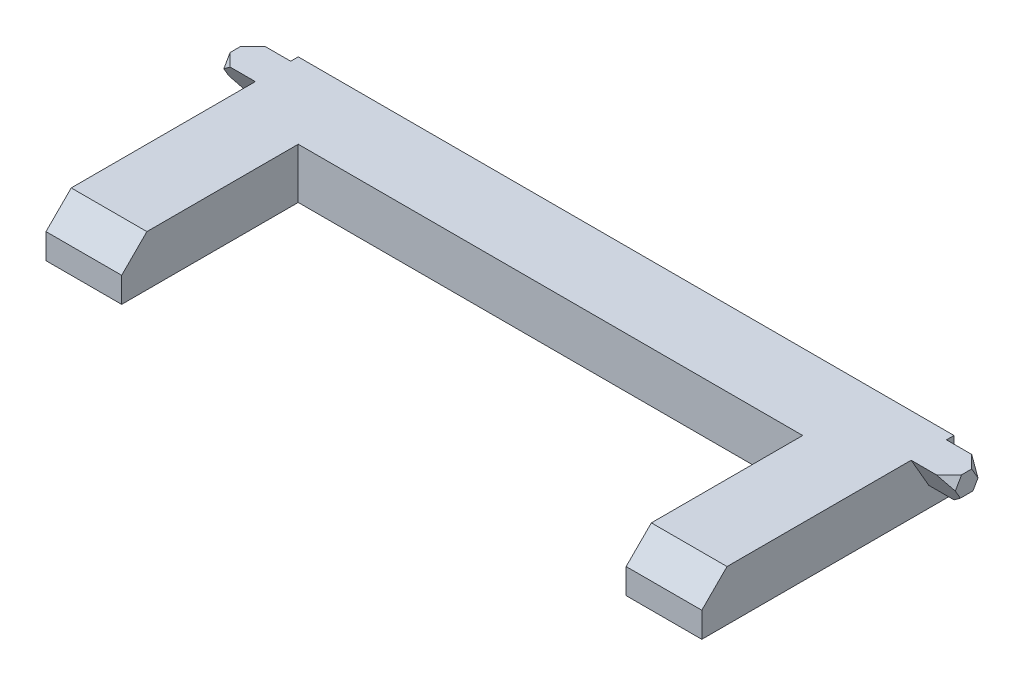
ISO-10303-21;
HEADER;
FILE_DESCRIPTION(('STEP AP214'),'2;1');
FILE_NAME('part.step','',(''),(''),'','','');
FILE_SCHEMA(('AUTOMOTIVE_DESIGN { 1 0 10303 214 1 1 1 1 }'));
ENDSEC;
DATA;
#1=APPLICATION_CONTEXT('core data for automotive mechanical design processes');
#2=APPLICATION_PROTOCOL_DEFINITION('international standard','automotive_design',2000,#1);
#3=PRODUCT_CONTEXT('',#1,'mechanical');
#4=PRODUCT('Part','Part','',(#3));
#5=PRODUCT_RELATED_PRODUCT_CATEGORY('part','',(#4));
#6=PRODUCT_DEFINITION_FORMATION('','',#4);
#7=PRODUCT_DEFINITION_CONTEXT('part definition',#1,'design');
#8=PRODUCT_DEFINITION('design','',#6,#7);
#9=PRODUCT_DEFINITION_SHAPE('','',#8);
#10=(LENGTH_UNIT() NAMED_UNIT(*) SI_UNIT(.MILLI.,.METRE.));
#11=(NAMED_UNIT(*) PLANE_ANGLE_UNIT() SI_UNIT($,.RADIAN.));
#12=(NAMED_UNIT(*) SI_UNIT($,.STERADIAN.) SOLID_ANGLE_UNIT());
#13=UNCERTAINTY_MEASURE_WITH_UNIT(LENGTH_MEASURE(1.E-05),#10,'distance_accuracy_value','');
#14=(GEOMETRIC_REPRESENTATION_CONTEXT(3) GLOBAL_UNCERTAINTY_ASSIGNED_CONTEXT((#13)) GLOBAL_UNIT_ASSIGNED_CONTEXT((#10,
#11,#12)) REPRESENTATION_CONTEXT('',''));
#15=CARTESIAN_POINT('',(0.,0.,0.));
#16=DIRECTION('',(0.,0.,1.));
#17=DIRECTION('',(1.,0.,0.));
#18=AXIS2_PLACEMENT_3D('',#15,#16,#17);
#19=CARTESIAN_POINT('',(0.,2.,0.));
#20=DIRECTION('',(0.,1.,0.));
#21=DIRECTION('',(0.,0.,1.));
#22=AXIS2_PLACEMENT_3D('',#19,#20,#21);
#23=PLANE('',#22);
#24=DIRECTION('',(-1.,0.,0.));
#25=VECTOR('',#24,1.);
#26=CARTESIAN_POINT('',(14.5,2.,5.99999999999999));
#27=LINE('',#26,#25);
#28=CARTESIAN_POINT('',(13.,2.,5.99999999999999));
#29=VERTEX_POINT('',#28);
#30=CARTESIAN_POINT('',(10.,2.,5.99999999999999));
#31=VERTEX_POINT('',#30);
#32=EDGE_CURVE('E189',#29,#31,#27,.T.);
#33=ORIENTED_EDGE('',*,*,#32,.F.);
#34=DIRECTION('',(0.,0.,-1.));
#35=VECTOR('',#34,1.);
#36=CARTESIAN_POINT('',(13.,2.,7.));
#37=LINE('',#36,#35);
#38=CARTESIAN_POINT('',(13.,2.,-1.3));
#39=VERTEX_POINT('',#38);
#40=EDGE_CURVE('E219',#29,#39,#37,.T.);
#41=ORIENTED_EDGE('',*,*,#40,.T.);
#42=DIRECTION('',(-1.,0.,0.));
#43=VECTOR('',#42,1.);
#44=CARTESIAN_POINT('',(14.5,2.,-1.3));
#45=LINE('',#44,#43);
#46=CARTESIAN_POINT('',(14.,2.,-1.3));
#47=VERTEX_POINT('',#46);
#48=EDGE_CURVE('E321',#47,#39,#45,.T.);
#49=ORIENTED_EDGE('',*,*,#48,.F.);
#50=DIRECTION('',(0.707106781186548,0.,-0.707106781186547));
#51=VECTOR('',#50,1.);
#52=CARTESIAN_POINT('',(6.34999999999999,2.,6.35));
#53=LINE('',#52,#51);
#54=CARTESIAN_POINT('',(14.5,2.,-1.8));
#55=VERTEX_POINT('',#54);
#56=EDGE_CURVE('E292',#47,#55,#53,.T.);
#57=ORIENTED_EDGE('',*,*,#56,.T.);
#58=DIRECTION('',(0.,0.,1.));
#59=VECTOR('',#58,1.);
#60=CARTESIAN_POINT('',(14.5,2.,-2.7));
#61=LINE('',#60,#59);
#62=CARTESIAN_POINT('',(14.5,2.,-2.2));
#63=VERTEX_POINT('',#62);
#64=EDGE_CURVE('E313',#63,#55,#61,.T.);
#65=ORIENTED_EDGE('',*,*,#64,.F.);
#66=DIRECTION('',(-0.707106781186548,0.,-0.707106781186547));
#67=VECTOR('',#66,1.);
#68=CARTESIAN_POINT('',(8.34999999999999,2.,-8.35));
#69=LINE('',#68,#67);
#70=CARTESIAN_POINT('',(14.,2.,-2.7));
#71=VERTEX_POINT('',#70);
#72=EDGE_CURVE('E301',#63,#71,#69,.T.);
#73=ORIENTED_EDGE('',*,*,#72,.T.);
#74=DIRECTION('',(-1.,0.,0.));
#75=VECTOR('',#74,1.);
#76=CARTESIAN_POINT('',(14.5,2.,-2.7));
#77=LINE('',#76,#75);
#78=CARTESIAN_POINT('',(13.,2.,-2.7));
#79=VERTEX_POINT('',#78);
#80=EDGE_CURVE('E336',#71,#79,#77,.T.);
#81=ORIENTED_EDGE('',*,*,#80,.T.);
#82=CARTESIAN_POINT('',(13.,2.,-3.));
#83=VERTEX_POINT('',#82);
#84=EDGE_CURVE('E218',#79,#83,#37,.T.);
#85=ORIENTED_EDGE('',*,*,#84,.T.);
#86=DIRECTION('',(-1.,0.,0.));
#87=VECTOR('',#86,1.);
#88=CARTESIAN_POINT('',(-10.,2.,-3.));
#89=LINE('',#88,#87);
#90=CARTESIAN_POINT('',(-13.,2.,-3.));
#91=VERTEX_POINT('',#90);
#92=EDGE_CURVE('E204',#83,#91,#89,.T.);
#93=ORIENTED_EDGE('',*,*,#92,.T.);
#94=DIRECTION('',(0.,0.,1.));
#95=VECTOR('',#94,1.);
#96=CARTESIAN_POINT('',(-13.,2.,7.));
#97=LINE('',#96,#95);
#98=CARTESIAN_POINT('',(-13.,2.,-2.7));
#99=VERTEX_POINT('',#98);
#100=EDGE_CURVE('E203',#91,#99,#97,.T.);
#101=ORIENTED_EDGE('',*,*,#100,.T.);
#102=DIRECTION('',(1.,0.,0.));
#103=VECTOR('',#102,1.);
#104=CARTESIAN_POINT('',(-14.5,2.,-2.7));
#105=LINE('',#104,#103);
#106=CARTESIAN_POINT('',(-14.,2.,-2.7));
#107=VERTEX_POINT('',#106);
#108=EDGE_CURVE('E353',#107,#99,#105,.T.);
#109=ORIENTED_EDGE('',*,*,#108,.F.);
#110=DIRECTION('',(-0.707106781186548,0.,0.707106781186547));
#111=VECTOR('',#110,1.);
#112=CARTESIAN_POINT('',(-8.34999999999999,2.,-8.35));
#113=LINE('',#112,#111);
#114=CARTESIAN_POINT('',(-14.5,2.,-2.2));
#115=VERTEX_POINT('',#114);
#116=EDGE_CURVE('E277',#107,#115,#113,.T.);
#117=ORIENTED_EDGE('',*,*,#116,.T.);
#118=DIRECTION('',(0.,0.,1.));
#119=VECTOR('',#118,1.);
#120=CARTESIAN_POINT('',(-14.5,2.,-2.7));
#121=LINE('',#120,#119);
#122=CARTESIAN_POINT('',(-14.5,2.,-1.79999999999999));
#123=VERTEX_POINT('',#122);
#124=EDGE_CURVE('E346',#115,#123,#121,.T.);
#125=ORIENTED_EDGE('',*,*,#124,.T.);
#126=DIRECTION('',(-0.707106781186548,0.,-0.707106781186547));
#127=VECTOR('',#126,1.);
#128=CARTESIAN_POINT('',(-6.34999999999999,2.,6.35));
#129=LINE('',#128,#127);
#130=CARTESIAN_POINT('',(-14.,2.,-1.3));
#131=VERTEX_POINT('',#130);
#132=EDGE_CURVE('E269',#131,#123,#129,.T.);
#133=ORIENTED_EDGE('',*,*,#132,.F.);
#134=DIRECTION('',(1.,0.,0.));
#135=VECTOR('',#134,1.);
#136=CARTESIAN_POINT('',(-14.5,2.,-1.3));
#137=LINE('',#136,#135);
#138=CARTESIAN_POINT('',(-13.,2.,-1.3));
#139=VERTEX_POINT('',#138);
#140=EDGE_CURVE('E201',#131,#139,#137,.T.);
#141=ORIENTED_EDGE('',*,*,#140,.T.);
#142=CARTESIAN_POINT('',(-13.,2.,5.99999999999999));
#143=VERTEX_POINT('',#142);
#144=EDGE_CURVE('E195',#139,#143,#97,.T.);
#145=ORIENTED_EDGE('',*,*,#144,.T.);
#146=CARTESIAN_POINT('',(-10.,2.,5.99999999999999));
#147=VERTEX_POINT('',#146);
#148=EDGE_CURVE('E181',#147,#143,#27,.T.);
#149=ORIENTED_EDGE('',*,*,#148,.F.);
#150=DIRECTION('',(0.,0.,-1.));
#151=VECTOR('',#150,1.);
#152=CARTESIAN_POINT('',(-10.,2.,0.));
#153=LINE('',#152,#151);
#154=CARTESIAN_POINT('',(-10.,2.,0.));
#155=VERTEX_POINT('',#154);
#156=EDGE_CURVE('E207',#147,#155,#153,.T.);
#157=ORIENTED_EDGE('',*,*,#156,.T.);
#158=DIRECTION('',(1.,0.,0.));
#159=VECTOR('',#158,1.);
#160=CARTESIAN_POINT('',(10.,2.,0.));
#161=LINE('',#160,#159);
#162=CARTESIAN_POINT('',(10.,2.,0.));
#163=VERTEX_POINT('',#162);
#164=EDGE_CURVE('E213',#155,#163,#161,.T.);
#165=ORIENTED_EDGE('',*,*,#164,.T.);
#166=DIRECTION('',(0.,0.,1.));
#167=VECTOR('',#166,1.);
#168=CARTESIAN_POINT('',(10.,2.,0.));
#169=LINE('',#168,#167);
#170=EDGE_CURVE('E215',#163,#31,#169,.T.);
#171=ORIENTED_EDGE('',*,*,#170,.T.);
#172=EDGE_LOOP('',(#33,#41,#49,#57,#65,#73,#81,#85,#93,#101,#109,#117,#125,#133,#141,#145,#149,
#157,#165,#171));
#173=FACE_BOUND('',#172,.T.);
#174=ADVANCED_FACE('F35',(#173),#23,.T.);
#175=CARTESIAN_POINT('',(13.,2.,7.));
#176=DIRECTION('',(-1.,0.,0.));
#177=DIRECTION('',(0.,0.,1.));
#178=AXIS2_PLACEMENT_3D('',#175,#176,#177);
#179=PLANE('',#178);
#180=ORIENTED_EDGE('',*,*,#40,.F.);
#181=DIRECTION('',(0.,-0.707106781186544,0.707106781186552));
#182=VECTOR('',#181,1.);
#183=CARTESIAN_POINT('',(13.,1.49999999999999,6.5));
#184=LINE('',#183,#182);
#185=CARTESIAN_POINT('',(13.,1.,7.));
#186=VERTEX_POINT('',#185);
#187=EDGE_CURVE('E330',#29,#186,#184,.T.);
#188=ORIENTED_EDGE('',*,*,#187,.T.);
#189=DIRECTION('',(0.,-1.,0.));
#190=VECTOR('',#189,1.);
#191=CARTESIAN_POINT('',(13.,2.,7.));
#192=LINE('',#191,#190);
#193=CARTESIAN_POINT('',(13.,0.,7.));
#194=VERTEX_POINT('',#193);
#195=EDGE_CURVE('E242',#186,#194,#192,.T.);
#196=ORIENTED_EDGE('',*,*,#195,.T.);
#197=DIRECTION('',(0.,0.,-1.));
#198=VECTOR('',#197,1.);
#199=CARTESIAN_POINT('',(13.,0.,7.));
#200=LINE('',#199,#198);
#201=CARTESIAN_POINT('',(13.,0.,-3.));
#202=VERTEX_POINT('',#201);
#203=EDGE_CURVE('E237',#194,#202,#200,.T.);
#204=ORIENTED_EDGE('',*,*,#203,.T.);
#205=DIRECTION('',(0.,-1.,0.));
#206=VECTOR('',#205,1.);
#207=CARTESIAN_POINT('',(13.,2.,-3.));
#208=LINE('',#207,#206);
#209=EDGE_CURVE('E221',#83,#202,#208,.T.);
#210=ORIENTED_EDGE('',*,*,#209,.F.);
#211=ORIENTED_EDGE('',*,*,#84,.F.);
#212=DIRECTION('',(0.,0.866025403784439,-0.5));
#213=VECTOR('',#212,1.);
#214=CARTESIAN_POINT('',(13.,0.787564434701785,-2.));
#215=LINE('',#214,#213);
#216=CARTESIAN_POINT('',(13.,0.787564434701785,-2.));
#217=VERTEX_POINT('',#216);
#218=EDGE_CURVE('E323',#217,#79,#215,.T.);
#219=ORIENTED_EDGE('',*,*,#218,.F.);
#220=DIRECTION('',(0.,-0.866025403784439,-0.5));
#221=VECTOR('',#220,1.);
#222=CARTESIAN_POINT('',(13.,2.,-1.3));
#223=LINE('',#222,#221);
#224=EDGE_CURVE('E327',#39,#217,#223,.T.);
#225=ORIENTED_EDGE('',*,*,#224,.F.);
#226=EDGE_LOOP('',(#180,#188,#196,#204,#210,#211,#219,#225));
#227=FACE_BOUND('',#226,.T.);
#228=ADVANCED_FACE('F388',(#227),#179,.F.);
#229=CARTESIAN_POINT('',(-14.5,0.787564434701785,-2.));
#230=DIRECTION('',(0.,-0.5,-0.866025403784439));
#231=DIRECTION('',(0.,0.866025403784439,-0.5));
#232=AXIS2_PLACEMENT_3D('',#229,#230,#231);
#233=PLANE('',#232);
#234=DIRECTION('',(0.,0.866025403784439,-0.5));
#235=VECTOR('',#234,1.);
#236=CARTESIAN_POINT('',(-14.5,0.787564434701785,-2.));
#237=LINE('',#236,#235);
#238=CARTESIAN_POINT('',(-14.5,1.22057713659401,-2.25));
#239=VERTEX_POINT('',#238);
#240=CARTESIAN_POINT('',(-14.5,1.56698729810778,-2.45));
#241=VERTEX_POINT('',#240);
#242=EDGE_CURVE('E342',#239,#241,#237,.T.);
#243=ORIENTED_EDGE('',*,*,#242,.T.);
#244=DIRECTION('',(0.707106781186548,0.612372435695794,-0.353553390593273));
#245=VECTOR('',#244,1.);
#246=CARTESIAN_POINT('',(-14.95,1.17727586640478,-2.225));
#247=LINE('',#246,#245);
#248=EDGE_CURVE('E280',#241,#107,#247,.T.);
#249=ORIENTED_EDGE('',*,*,#248,.T.);
#250=ORIENTED_EDGE('',*,*,#108,.T.);
#251=DIRECTION('',(0.,0.866025403784439,-0.5));
#252=VECTOR('',#251,1.);
#253=CARTESIAN_POINT('',(-13.,0.787564434701785,-2.));
#254=LINE('',#253,#252);
#255=CARTESIAN_POINT('',(-13.,0.787564434701785,-2.));
#256=VERTEX_POINT('',#255);
#257=EDGE_CURVE('E343',#256,#99,#254,.T.);
#258=ORIENTED_EDGE('',*,*,#257,.F.);
#259=DIRECTION('',(1.,0.,0.));
#260=VECTOR('',#259,1.);
#261=CARTESIAN_POINT('',(-14.5,0.787564434701785,-2.));
#262=LINE('',#261,#260);
#263=CARTESIAN_POINT('',(-14.,0.787564434701785,-2.));
#264=VERTEX_POINT('',#263);
#265=EDGE_CURVE('E348',#264,#256,#262,.T.);
#266=ORIENTED_EDGE('',*,*,#265,.F.);
#267=DIRECTION('',(0.707106781186548,-0.612372435695795,0.353553390593274));
#268=VECTOR('',#267,1.);
#269=CARTESIAN_POINT('',(-14.25,1.0040707856479,-2.125));
#270=LINE('',#269,#268);
#271=EDGE_CURVE('E261',#239,#264,#270,.T.);
#272=ORIENTED_EDGE('',*,*,#271,.F.);
#273=EDGE_LOOP('',(#243,#249,#250,#258,#266,#272));
#274=FACE_BOUND('',#273,.T.);
#275=ADVANCED_FACE('F361',(#274),#233,.T.);
#276=CARTESIAN_POINT('',(-14.5,0.,0.));
#277=DIRECTION('',(1.,0.,0.));
#278=DIRECTION('',(0.,0.,-1.));
#279=AXIS2_PLACEMENT_3D('',#276,#277,#278);
#280=PLANE('',#279);
#281=DIRECTION('',(0.,0.866025403784438,0.5));
#282=VECTOR('',#281,1.);
#283=CARTESIAN_POINT('',(-14.5,1.45262794416288,-2.51602540378444));
#284=LINE('',#283,#282);
#285=EDGE_CURVE('E275',#241,#115,#284,.T.);
#286=ORIENTED_EDGE('',*,*,#285,.F.);
#287=ORIENTED_EDGE('',*,*,#242,.F.);
#288=DIRECTION('',(0.,0.,1.));
#289=VECTOR('',#288,1.);
#290=CARTESIAN_POINT('',(-14.5,1.22057713659401,0.));
#291=LINE('',#290,#289);
#292=CARTESIAN_POINT('',(-14.5,1.22057713659401,-1.75));
#293=VERTEX_POINT('',#292);
#294=EDGE_CURVE('E263',#239,#293,#291,.T.);
#295=ORIENTED_EDGE('',*,*,#294,.T.);
#296=DIRECTION('',(0.,-0.866025403784439,-0.5));
#297=VECTOR('',#296,1.);
#298=CARTESIAN_POINT('',(-14.5,2.,-1.3));
#299=LINE('',#298,#297);
#300=CARTESIAN_POINT('',(-14.5,1.56698729810778,-1.55));
#301=VERTEX_POINT('',#300);
#302=EDGE_CURVE('E340',#301,#293,#299,.T.);
#303=ORIENTED_EDGE('',*,*,#302,.F.);
#304=DIRECTION('',(0.,0.866025403784439,-0.5));
#305=VECTOR('',#304,1.);
#306=CARTESIAN_POINT('',(-14.5,-0.279422863405994,-0.48397459621556));
#307=LINE('',#306,#305);
#308=EDGE_CURVE('E266',#301,#123,#307,.T.);
#309=ORIENTED_EDGE('',*,*,#308,.T.);
#310=ORIENTED_EDGE('',*,*,#124,.F.);
#311=EDGE_LOOP('',(#286,#287,#295,#303,#309,#310));
#312=FACE_BOUND('',#311,.T.);
#313=ADVANCED_FACE('F446',(#312),#280,.F.);
#314=CARTESIAN_POINT('',(-13.,2.,7.));
#315=DIRECTION('',(1.,0.,0.));
#316=DIRECTION('',(0.,0.,-1.));
#317=AXIS2_PLACEMENT_3D('',#314,#315,#316);
#318=PLANE('',#317);
#319=DIRECTION('',(0.,-1.,0.));
#320=VECTOR('',#319,1.);
#321=CARTESIAN_POINT('',(-13.,2.,7.));
#322=LINE('',#321,#320);
#323=CARTESIAN_POINT('',(-13.,1.,7.));
#324=VERTEX_POINT('',#323);
#325=CARTESIAN_POINT('',(-13.,0.,7.));
#326=VERTEX_POINT('',#325);
#327=EDGE_CURVE('E197',#324,#326,#322,.T.);
#328=ORIENTED_EDGE('',*,*,#327,.F.);
#329=DIRECTION('',(0.,-0.707106781186544,0.707106781186552));
#330=VECTOR('',#329,1.);
#331=CARTESIAN_POINT('',(-13.,1.,7.));
#332=LINE('',#331,#330);
#333=EDGE_CURVE('E184',#143,#324,#332,.T.);
#334=ORIENTED_EDGE('',*,*,#333,.F.);
#335=ORIENTED_EDGE('',*,*,#144,.F.);
#336=DIRECTION('',(0.,-0.866025403784439,-0.5));
#337=VECTOR('',#336,1.);
#338=CARTESIAN_POINT('',(-13.,2.,-1.3));
#339=LINE('',#338,#337);
#340=EDGE_CURVE('E335',#139,#256,#339,.T.);
#341=ORIENTED_EDGE('',*,*,#340,.T.);
#342=ORIENTED_EDGE('',*,*,#257,.T.);
#343=ORIENTED_EDGE('',*,*,#100,.F.);
#344=DIRECTION('',(0.,-1.,0.));
#345=VECTOR('',#344,1.);
#346=CARTESIAN_POINT('',(-13.,2.,-3.));
#347=LINE('',#346,#345);
#348=CARTESIAN_POINT('',(-13.,0.,-3.));
#349=VERTEX_POINT('',#348);
#350=EDGE_CURVE('E255',#91,#349,#347,.T.);
#351=ORIENTED_EDGE('',*,*,#350,.T.);
#352=DIRECTION('',(0.,0.,1.));
#353=VECTOR('',#352,1.);
#354=CARTESIAN_POINT('',(-13.,0.,7.));
#355=LINE('',#354,#353);
#356=EDGE_CURVE('E222',#349,#326,#355,.T.);
#357=ORIENTED_EDGE('',*,*,#356,.T.);
#358=EDGE_LOOP('',(#328,#334,#335,#341,#342,#343,#351,#357));
#359=FACE_BOUND('',#358,.T.);
#360=ADVANCED_FACE('F37',(#359),#318,.F.);
#361=CARTESIAN_POINT('',(-13.,2.,7.));
#362=DIRECTION('',(0.,0.,-1.));
#363=DIRECTION('',(-1.,0.,0.));
#364=AXIS2_PLACEMENT_3D('',#361,#362,#363);
#365=PLANE('',#364);
#366=DIRECTION('',(0.,-1.,0.));
#367=VECTOR('',#366,1.);
#368=CARTESIAN_POINT('',(-10.,2.,7.));
#369=LINE('',#368,#367);
#370=CARTESIAN_POINT('',(-10.,0.999999999999997,7.));
#371=VERTEX_POINT('',#370);
#372=CARTESIAN_POINT('',(-10.,0.,7.));
#373=VERTEX_POINT('',#372);
#374=EDGE_CURVE('E252',#371,#373,#369,.T.);
#375=ORIENTED_EDGE('',*,*,#374,.F.);
#376=DIRECTION('',(-1.,0.,0.));
#377=VECTOR('',#376,1.);
#378=CARTESIAN_POINT('',(14.5,1.,7.));
#379=LINE('',#378,#377);
#380=EDGE_CURVE('E50',#371,#324,#379,.T.);
#381=ORIENTED_EDGE('',*,*,#380,.T.);
#382=ORIENTED_EDGE('',*,*,#327,.T.);
#383=DIRECTION('',(1.,0.,0.));
#384=VECTOR('',#383,1.);
#385=CARTESIAN_POINT('',(-13.,0.,7.));
#386=LINE('',#385,#384);
#387=EDGE_CURVE('E224',#326,#373,#386,.T.);
#388=ORIENTED_EDGE('',*,*,#387,.T.);
#389=EDGE_LOOP('',(#375,#381,#382,#388));
#390=FACE_BOUND('',#389,.T.);
#391=ADVANCED_FACE('F380',(#390),#365,.F.);
#392=CARTESIAN_POINT('',(-10.,2.,0.));
#393=DIRECTION('',(-1.,0.,0.));
#394=DIRECTION('',(0.,0.,1.));
#395=AXIS2_PLACEMENT_3D('',#392,#393,#394);
#396=PLANE('',#395);
#397=ORIENTED_EDGE('',*,*,#156,.F.);
#398=DIRECTION('',(0.,-0.707106781186544,0.707106781186552));
#399=VECTOR('',#398,1.);
#400=CARTESIAN_POINT('',(-10.,4.99999999999999,2.99999999999996));
#401=LINE('',#400,#399);
#402=EDGE_CURVE('E185',#147,#371,#401,.T.);
#403=ORIENTED_EDGE('',*,*,#402,.T.);
#404=ORIENTED_EDGE('',*,*,#374,.T.);
#405=DIRECTION('',(0.,0.,-1.));
#406=VECTOR('',#405,1.);
#407=CARTESIAN_POINT('',(-10.,0.,0.));
#408=LINE('',#407,#406);
#409=CARTESIAN_POINT('',(-10.,0.,0.));
#410=VERTEX_POINT('',#409);
#411=EDGE_CURVE('E227',#373,#410,#408,.T.);
#412=ORIENTED_EDGE('',*,*,#411,.T.);
#413=DIRECTION('',(0.,-1.,0.));
#414=VECTOR('',#413,1.);
#415=CARTESIAN_POINT('',(-10.,2.,0.));
#416=LINE('',#415,#414);
#417=EDGE_CURVE('E249',#155,#410,#416,.T.);
#418=ORIENTED_EDGE('',*,*,#417,.F.);
#419=EDGE_LOOP('',(#397,#403,#404,#412,#418));
#420=FACE_BOUND('',#419,.T.);
#421=ADVANCED_FACE('F438',(#420),#396,.F.);
#422=CARTESIAN_POINT('',(10.,2.,0.));
#423=DIRECTION('',(0.,0.,-1.));
#424=DIRECTION('',(-1.,0.,0.));
#425=AXIS2_PLACEMENT_3D('',#422,#423,#424);
#426=PLANE('',#425);
#427=DIRECTION('',(1.,0.,0.));
#428=VECTOR('',#427,1.);
#429=CARTESIAN_POINT('',(10.,0.,0.));
#430=LINE('',#429,#428);
#431=CARTESIAN_POINT('',(10.,0.,0.));
#432=VERTEX_POINT('',#431);
#433=EDGE_CURVE('E229',#410,#432,#430,.T.);
#434=ORIENTED_EDGE('',*,*,#433,.T.);
#435=DIRECTION('',(0.,-1.,0.));
#436=VECTOR('',#435,1.);
#437=CARTESIAN_POINT('',(10.,2.,0.));
#438=LINE('',#437,#436);
#439=EDGE_CURVE('E246',#163,#432,#438,.T.);
#440=ORIENTED_EDGE('',*,*,#439,.F.);
#441=ORIENTED_EDGE('',*,*,#164,.F.);
#442=ORIENTED_EDGE('',*,*,#417,.T.);
#443=EDGE_LOOP('',(#434,#440,#441,#442));
#444=FACE_BOUND('',#443,.T.);
#445=ADVANCED_FACE('F434',(#444),#426,.F.);
#446=CARTESIAN_POINT('',(10.,2.,0.));
#447=DIRECTION('',(1.,0.,0.));
#448=DIRECTION('',(0.,0.,-1.));
#449=AXIS2_PLACEMENT_3D('',#446,#447,#448);
#450=PLANE('',#449);
#451=DIRECTION('',(0.,-1.,0.));
#452=VECTOR('',#451,1.);
#453=CARTESIAN_POINT('',(10.,2.,7.));
#454=LINE('',#453,#452);
#455=CARTESIAN_POINT('',(10.,1.,7.));
#456=VERTEX_POINT('',#455);
#457=CARTESIAN_POINT('',(10.,0.,7.));
#458=VERTEX_POINT('',#457);
#459=EDGE_CURVE('E244',#456,#458,#454,.T.);
#460=ORIENTED_EDGE('',*,*,#459,.F.);
#461=DIRECTION('',(0.,0.707106781186544,-0.707106781186552));
#462=VECTOR('',#461,1.);
#463=CARTESIAN_POINT('',(10.,4.99999999999999,2.99999999999996));
#464=LINE('',#463,#462);
#465=EDGE_CURVE('E58',#456,#31,#464,.T.);
#466=ORIENTED_EDGE('',*,*,#465,.T.);
#467=ORIENTED_EDGE('',*,*,#170,.F.);
#468=ORIENTED_EDGE('',*,*,#439,.T.);
#469=DIRECTION('',(0.,0.,1.));
#470=VECTOR('',#469,1.);
#471=CARTESIAN_POINT('',(10.,0.,0.));
#472=LINE('',#471,#470);
#473=EDGE_CURVE('E231',#432,#458,#472,.T.);
#474=ORIENTED_EDGE('',*,*,#473,.T.);
#475=EDGE_LOOP('',(#460,#466,#467,#468,#474));
#476=FACE_BOUND('',#475,.T.);
#477=ADVANCED_FACE('F431',(#476),#450,.F.);
#478=CARTESIAN_POINT('',(13.,2.,7.));
#479=DIRECTION('',(0.,0.,-1.));
#480=DIRECTION('',(-1.,0.,0.));
#481=AXIS2_PLACEMENT_3D('',#478,#479,#480);
#482=PLANE('',#481);
#483=ORIENTED_EDGE('',*,*,#195,.F.);
#484=DIRECTION('',(-1.,0.,0.));
#485=VECTOR('',#484,1.);
#486=CARTESIAN_POINT('',(13.,1.,7.));
#487=LINE('',#486,#485);
#488=EDGE_CURVE('E11',#186,#456,#487,.T.);
#489=ORIENTED_EDGE('',*,*,#488,.T.);
#490=ORIENTED_EDGE('',*,*,#459,.T.);
#491=DIRECTION('',(1.,0.,0.));
#492=VECTOR('',#491,1.);
#493=CARTESIAN_POINT('',(13.,0.,7.));
#494=LINE('',#493,#492);
#495=EDGE_CURVE('E234',#458,#194,#494,.T.);
#496=ORIENTED_EDGE('',*,*,#495,.T.);
#497=EDGE_LOOP('',(#483,#489,#490,#496));
#498=FACE_BOUND('',#497,.T.);
#499=ADVANCED_FACE('F391',(#498),#482,.F.);
#500=CARTESIAN_POINT('',(13.,2.,-3.));
#501=DIRECTION('',(0.,0.,1.));
#502=DIRECTION('',(1.,0.,0.));
#503=AXIS2_PLACEMENT_3D('',#500,#501,#502);
#504=PLANE('',#503);
#505=DIRECTION('',(-1.,0.,0.));
#506=VECTOR('',#505,1.);
#507=CARTESIAN_POINT('',(13.,0.,-3.));
#508=LINE('',#507,#506);
#509=EDGE_CURVE('E208',#202,#349,#508,.T.);
#510=ORIENTED_EDGE('',*,*,#509,.T.);
#511=ORIENTED_EDGE('',*,*,#350,.F.);
#512=ORIENTED_EDGE('',*,*,#92,.F.);
#513=ORIENTED_EDGE('',*,*,#209,.T.);
#514=EDGE_LOOP('',(#510,#511,#512,#513));
#515=FACE_BOUND('',#514,.T.);
#516=ADVANCED_FACE('F369',(#515),#504,.F.);
#517=CARTESIAN_POINT('',(0.,0.,0.));
#518=DIRECTION('',(0.,1.,0.));
#519=DIRECTION('',(0.,0.,1.));
#520=AXIS2_PLACEMENT_3D('',#517,#518,#519);
#521=PLANE('',#520);
#522=ORIENTED_EDGE('',*,*,#356,.F.);
#523=ORIENTED_EDGE('',*,*,#509,.F.);
#524=ORIENTED_EDGE('',*,*,#203,.F.);
#525=ORIENTED_EDGE('',*,*,#495,.F.);
#526=ORIENTED_EDGE('',*,*,#473,.F.);
#527=ORIENTED_EDGE('',*,*,#433,.F.);
#528=ORIENTED_EDGE('',*,*,#411,.F.);
#529=ORIENTED_EDGE('',*,*,#387,.F.);
#530=EDGE_LOOP('',(#522,#523,#524,#525,#526,#527,#528,#529));
#531=FACE_BOUND('',#530,.T.);
#532=ADVANCED_FACE('F374',(#531),#521,.F.);
#533=CARTESIAN_POINT('',(-14.5,2.,-1.3));
#534=DIRECTION('',(0.,-0.5,0.866025403784439));
#535=DIRECTION('',(0.,-0.866025403784439,-0.5));
#536=AXIS2_PLACEMENT_3D('',#533,#534,#535);
#537=PLANE('',#536);
#538=DIRECTION('',(0.707106781186548,0.612372435695794,0.353553390593274));
#539=VECTOR('',#538,1.);
#540=CARTESIAN_POINT('',(-14.25,1.78349364905389,-1.425));
#541=LINE('',#540,#539);
#542=EDGE_CURVE('E272',#301,#131,#541,.T.);
#543=ORIENTED_EDGE('',*,*,#542,.F.);
#544=ORIENTED_EDGE('',*,*,#302,.T.);
#545=DIRECTION('',(-0.707106781186548,0.612372435695794,0.353553390593274));
#546=VECTOR('',#545,1.);
#547=CARTESIAN_POINT('',(-14.95,1.610288568297,-1.525));
#548=LINE('',#547,#546);
#549=EDGE_CURVE('E258',#264,#293,#548,.T.);
#550=ORIENTED_EDGE('',*,*,#549,.F.);
#551=ORIENTED_EDGE('',*,*,#265,.T.);
#552=ORIENTED_EDGE('',*,*,#340,.F.);
#553=ORIENTED_EDGE('',*,*,#140,.F.);
#554=EDGE_LOOP('',(#543,#544,#550,#551,#552,#553));
#555=FACE_BOUND('',#554,.T.);
#556=ADVANCED_FACE('F358',(#555),#537,.T.);
#557=CARTESIAN_POINT('',(-5.61025668138921,-6.47816641044592,0.));
#558=DIRECTION('',(0.654653670707977,0.755928946018455,0.));
#559=DIRECTION('',(-0.755928946018455,0.654653670707977,0.));
#560=AXIS2_PLACEMENT_3D('',#557,#558,#559);
#561=PLANE('',#560);
#562=ORIENTED_EDGE('',*,*,#271,.T.);
#563=ORIENTED_EDGE('',*,*,#549,.T.);
#564=ORIENTED_EDGE('',*,*,#294,.F.);
#565=EDGE_LOOP('',(#562,#563,#564));
#566=FACE_BOUND('',#565,.T.);
#567=ADVANCED_FACE('F457',(#566),#561,.F.);
#568=CARTESIAN_POINT('',(-5.93772880216253,3.42814932230353,5.93772880216254));
#569=DIRECTION('',(0.654653670707977,-0.377964473009227,-0.654653670707977));
#570=DIRECTION('',(-0.707106781186548,0.,-0.707106781186547));
#571=AXIS2_PLACEMENT_3D('',#568,#569,#570);
#572=PLANE('',#571);
#573=ORIENTED_EDGE('',*,*,#308,.F.);
#574=ORIENTED_EDGE('',*,*,#542,.T.);
#575=ORIENTED_EDGE('',*,*,#132,.T.);
#576=EDGE_LOOP('',(#573,#574,#575));
#577=FACE_BOUND('',#576,.T.);
#578=ADVANCED_FACE('F460',(#577),#572,.F.);
#579=CARTESIAN_POINT('',(-7.65201451644824,4.41789264091432,-7.65201451644825));
#580=DIRECTION('',(-0.654653670707977,0.377964473009228,-0.654653670707977));
#581=DIRECTION('',(-0.707106781186548,0.,0.707106781186547));
#582=AXIS2_PLACEMENT_3D('',#579,#580,#581);
#583=PLANE('',#582);
#584=ORIENTED_EDGE('',*,*,#248,.F.);
#585=ORIENTED_EDGE('',*,*,#285,.T.);
#586=ORIENTED_EDGE('',*,*,#116,.F.);
#587=EDGE_LOOP('',(#584,#585,#586));
#588=FACE_BOUND('',#587,.T.);
#589=ADVANCED_FACE('F464',(#588),#583,.T.);
#590=CARTESIAN_POINT('',(14.5,2.,-1.3));
#591=DIRECTION('',(0.,0.5,-0.866025403784439));
#592=DIRECTION('',(0.,0.866025403784439,0.5));
#593=AXIS2_PLACEMENT_3D('',#590,#591,#592);
#594=PLANE('',#593);
#595=DIRECTION('',(0.707106781186548,-0.612372435695794,-0.353553390593274));
#596=VECTOR('',#595,1.);
#597=CARTESIAN_POINT('',(14.25,1.78349364905389,-1.425));
#598=LINE('',#597,#596);
#599=CARTESIAN_POINT('',(14.5,1.56698729810778,-1.55));
#600=VERTEX_POINT('',#599);
#601=EDGE_CURVE('E295',#47,#600,#598,.T.);
#602=ORIENTED_EDGE('',*,*,#601,.F.);
#603=ORIENTED_EDGE('',*,*,#48,.T.);
#604=ORIENTED_EDGE('',*,*,#224,.T.);
#605=DIRECTION('',(-1.,0.,0.));
#606=VECTOR('',#605,1.);
#607=CARTESIAN_POINT('',(14.5,0.787564434701785,-2.));
#608=LINE('',#607,#606);
#609=CARTESIAN_POINT('',(14.,0.787564434701785,-2.));
#610=VERTEX_POINT('',#609);
#611=EDGE_CURVE('E333',#610,#217,#608,.T.);
#612=ORIENTED_EDGE('',*,*,#611,.F.);
#613=DIRECTION('',(-0.707106781186548,-0.612372435695794,-0.353553390593274));
#614=VECTOR('',#613,1.);
#615=CARTESIAN_POINT('',(14.95,1.610288568297,-1.525));
#616=LINE('',#615,#614);
#617=CARTESIAN_POINT('',(14.5,1.22057713659401,-1.75));
#618=VERTEX_POINT('',#617);
#619=EDGE_CURVE('E283',#618,#610,#616,.T.);
#620=ORIENTED_EDGE('',*,*,#619,.F.);
#621=DIRECTION('',(0.,-0.866025403784439,-0.5));
#622=VECTOR('',#621,1.);
#623=CARTESIAN_POINT('',(14.5,2.,-1.3));
#624=LINE('',#623,#622);
#625=EDGE_CURVE('E319',#600,#618,#624,.T.);
#626=ORIENTED_EDGE('',*,*,#625,.F.);
#627=EDGE_LOOP('',(#602,#603,#604,#612,#620,#626));
#628=FACE_BOUND('',#627,.T.);
#629=ADVANCED_FACE('F401',(#628),#594,.F.);
#630=CARTESIAN_POINT('',(14.5,0.787564434701785,-2.));
#631=DIRECTION('',(0.,0.5,0.866025403784439));
#632=DIRECTION('',(0.,-0.866025403784439,0.5));
#633=AXIS2_PLACEMENT_3D('',#630,#631,#632);
#634=PLANE('',#633);
#635=DIRECTION('',(-0.707106781186548,0.612372435695794,-0.353553390593273));
#636=VECTOR('',#635,1.);
#637=CARTESIAN_POINT('',(14.95,1.17727586640478,-2.225));
#638=LINE('',#637,#636);
#639=CARTESIAN_POINT('',(14.5,1.56698729810778,-2.45));
#640=VERTEX_POINT('',#639);
#641=EDGE_CURVE('E303',#640,#71,#638,.T.);
#642=ORIENTED_EDGE('',*,*,#641,.F.);
#643=DIRECTION('',(0.,0.866025403784439,-0.5));
#644=VECTOR('',#643,1.);
#645=CARTESIAN_POINT('',(14.5,0.787564434701785,-2.));
#646=LINE('',#645,#644);
#647=CARTESIAN_POINT('',(14.5,1.22057713659401,-2.25));
#648=VERTEX_POINT('',#647);
#649=EDGE_CURVE('E315',#648,#640,#646,.T.);
#650=ORIENTED_EDGE('',*,*,#649,.F.);
#651=DIRECTION('',(0.707106781186548,0.612372435695795,-0.353553390593274));
#652=VECTOR('',#651,1.);
#653=CARTESIAN_POINT('',(14.25,1.0040707856479,-2.125));
#654=LINE('',#653,#652);
#655=EDGE_CURVE('E286',#610,#648,#654,.T.);
#656=ORIENTED_EDGE('',*,*,#655,.F.);
#657=ORIENTED_EDGE('',*,*,#611,.T.);
#658=ORIENTED_EDGE('',*,*,#218,.T.);
#659=ORIENTED_EDGE('',*,*,#80,.F.);
#660=EDGE_LOOP('',(#642,#650,#656,#657,#658,#659));
#661=FACE_BOUND('',#660,.T.);
#662=ADVANCED_FACE('F397',(#661),#634,.F.);
#663=CARTESIAN_POINT('',(14.5,0.,0.));
#664=DIRECTION('',(-1.,0.,0.));
#665=DIRECTION('',(0.,0.,-1.));
#666=AXIS2_PLACEMENT_3D('',#663,#664,#665);
#667=PLANE('',#666);
#668=DIRECTION('',(0.,-0.866025403784438,-0.5));
#669=VECTOR('',#668,1.);
#670=CARTESIAN_POINT('',(14.5,1.45262794416288,-2.51602540378444));
#671=LINE('',#670,#669);
#672=EDGE_CURVE('E43',#63,#640,#671,.T.);
#673=ORIENTED_EDGE('',*,*,#672,.F.);
#674=ORIENTED_EDGE('',*,*,#64,.T.);
#675=DIRECTION('',(0.,0.866025403784439,-0.5));
#676=VECTOR('',#675,1.);
#677=CARTESIAN_POINT('',(14.5,-0.279422863405994,-0.48397459621556));
#678=LINE('',#677,#676);
#679=EDGE_CURVE('E298',#600,#55,#678,.T.);
#680=ORIENTED_EDGE('',*,*,#679,.F.);
#681=ORIENTED_EDGE('',*,*,#625,.T.);
#682=DIRECTION('',(0.,0.,1.));
#683=VECTOR('',#682,1.);
#684=CARTESIAN_POINT('',(14.5,1.22057713659401,0.));
#685=LINE('',#684,#683);
#686=EDGE_CURVE('E289',#648,#618,#685,.T.);
#687=ORIENTED_EDGE('',*,*,#686,.F.);
#688=ORIENTED_EDGE('',*,*,#649,.T.);
#689=EDGE_LOOP('',(#673,#674,#680,#681,#687,#688));
#690=FACE_BOUND('',#689,.T.);
#691=ADVANCED_FACE('F312',(#690),#667,.F.);
#692=CARTESIAN_POINT('',(5.61025668138921,-6.47816641044592,0.));
#693=DIRECTION('',(0.654653670707977,-0.755928946018455,0.));
#694=DIRECTION('',(0.755928946018455,0.654653670707977,0.));
#695=AXIS2_PLACEMENT_3D('',#692,#693,#694);
#696=PLANE('',#695);
#697=ORIENTED_EDGE('',*,*,#686,.T.);
#698=ORIENTED_EDGE('',*,*,#619,.T.);
#699=ORIENTED_EDGE('',*,*,#655,.T.);
#700=EDGE_LOOP('',(#697,#698,#699));
#701=FACE_BOUND('',#700,.T.);
#702=ADVANCED_FACE('F404',(#701),#696,.T.);
#703=CARTESIAN_POINT('',(5.93772880216253,3.42814932230353,5.93772880216254));
#704=DIRECTION('',(0.654653670707977,0.377964473009227,0.654653670707977));
#705=DIRECTION('',(0.707106781186548,0.,-0.707106781186547));
#706=AXIS2_PLACEMENT_3D('',#703,#704,#705);
#707=PLANE('',#706);
#708=ORIENTED_EDGE('',*,*,#56,.F.);
#709=ORIENTED_EDGE('',*,*,#601,.T.);
#710=ORIENTED_EDGE('',*,*,#679,.T.);
#711=EDGE_LOOP('',(#708,#709,#710));
#712=FACE_BOUND('',#711,.T.);
#713=ADVANCED_FACE('F406',(#712),#707,.T.);
#714=CARTESIAN_POINT('',(7.65201451644824,4.41789264091432,-7.65201451644825));
#715=DIRECTION('',(0.654653670707977,0.377964473009228,-0.654653670707977));
#716=DIRECTION('',(-0.707106781186548,0.,-0.707106781186547));
#717=AXIS2_PLACEMENT_3D('',#714,#715,#716);
#718=PLANE('',#717);
#719=ORIENTED_EDGE('',*,*,#72,.F.);
#720=ORIENTED_EDGE('',*,*,#672,.T.);
#721=ORIENTED_EDGE('',*,*,#641,.T.);
#722=EDGE_LOOP('',(#719,#720,#721));
#723=FACE_BOUND('',#722,.T.);
#724=ADVANCED_FACE('F308',(#723),#718,.T.);
#725=CARTESIAN_POINT('',(14.5,1.,7.));
#726=DIRECTION('',(0.,-0.707106781186552,-0.707106781186544));
#727=DIRECTION('',(0.,0.707106781186544,-0.707106781186552));
#728=AXIS2_PLACEMENT_3D('',#725,#726,#727);
#729=PLANE('',#728);
#730=ORIENTED_EDGE('',*,*,#32,.T.);
#731=ORIENTED_EDGE('',*,*,#465,.F.);
#732=ORIENTED_EDGE('',*,*,#488,.F.);
#733=ORIENTED_EDGE('',*,*,#187,.F.);
#734=EDGE_LOOP('',(#730,#731,#732,#733));
#735=FACE_BOUND('',#734,.T.);
#736=ADVANCED_FACE('F413',(#735),#729,.F.);
#737=ORIENTED_EDGE('',*,*,#148,.T.);
#738=ORIENTED_EDGE('',*,*,#333,.T.);
#739=ORIENTED_EDGE('',*,*,#380,.F.);
#740=ORIENTED_EDGE('',*,*,#402,.F.);
#741=EDGE_LOOP('',(#737,#738,#739,#740));
#742=FACE_BOUND('',#741,.T.);
#743=ADVANCED_FACE('F183',(#742),#729,.F.);
#744=CLOSED_SHELL('',(#174,#228,#275,#313,#360,#391,#421,#445,#477,#499,#516,#532,#556,#567,
#578,#589,#629,#662,#691,#702,#713,#724,#736,#743));
#745=MANIFOLD_SOLID_BREP('B2',#744);
#746=ADVANCED_BREP_SHAPE_REPRESENTATION('',(#18,#745),#14);
#747=SHAPE_DEFINITION_REPRESENTATION(#9,#746);
ENDSEC;
END-ISO-10303-21;
